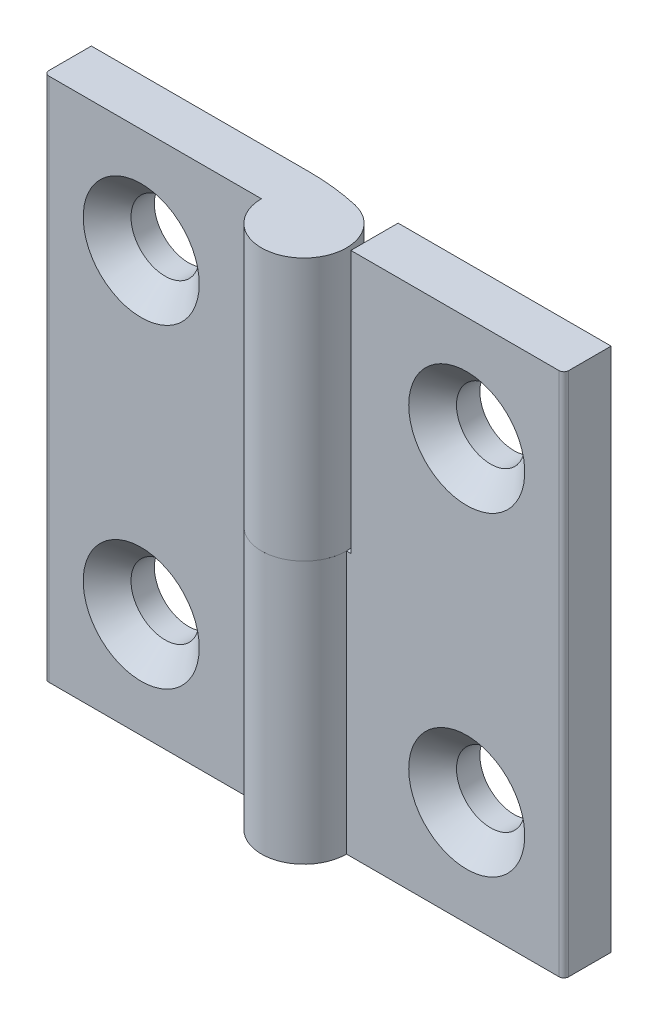
ISO-10303-21;
HEADER;
FILE_DESCRIPTION(('STEP AP214'),'2;1');
FILE_NAME('part.step','',(''),(''),'','','');
FILE_SCHEMA(('AUTOMOTIVE_DESIGN { 1 0 10303 214 1 1 1 1 }'));
ENDSEC;
DATA;
#1=APPLICATION_CONTEXT('core data for automotive mechanical design processes');
#2=APPLICATION_PROTOCOL_DEFINITION('international standard','automotive_design',2000,#1);
#3=PRODUCT_CONTEXT('',#1,'mechanical');
#4=PRODUCT('Part','Part','',(#3));
#5=PRODUCT_RELATED_PRODUCT_CATEGORY('part','',(#4));
#6=PRODUCT_DEFINITION_FORMATION('','',#4);
#7=PRODUCT_DEFINITION_CONTEXT('part definition',#1,'design');
#8=PRODUCT_DEFINITION('design','',#6,#7);
#9=PRODUCT_DEFINITION_SHAPE('','',#8);
#10=(LENGTH_UNIT() NAMED_UNIT(*) SI_UNIT(.MILLI.,.METRE.));
#11=(NAMED_UNIT(*) PLANE_ANGLE_UNIT() SI_UNIT($,.RADIAN.));
#12=(NAMED_UNIT(*) SI_UNIT($,.STERADIAN.) SOLID_ANGLE_UNIT());
#13=UNCERTAINTY_MEASURE_WITH_UNIT(LENGTH_MEASURE(1.E-05),#10,'distance_accuracy_value','');
#14=(GEOMETRIC_REPRESENTATION_CONTEXT(3) GLOBAL_UNCERTAINTY_ASSIGNED_CONTEXT((#13)) GLOBAL_UNIT_ASSIGNED_CONTEXT((#10,
#11,#12)) REPRESENTATION_CONTEXT('',''));
#15=CARTESIAN_POINT('',(0.,0.,0.));
#16=DIRECTION('',(0.,0.,1.));
#17=DIRECTION('',(1.,0.,0.));
#18=AXIS2_PLACEMENT_3D('',#15,#16,#17);
#19=CARTESIAN_POINT('',(-4.46399999999999,-25.,-5.87395000000017));
#20=DIRECTION('',(0.,0.,-1.));
#21=DIRECTION('',(-1.,0.,0.));
#22=AXIS2_PLACEMENT_3D('',#19,#20,#21);
#23=PLANE('',#22);
#24=DIRECTION('',(1.,0.,0.));
#25=VECTOR('',#24,1.);
#26=CARTESIAN_POINT('',(-4.46399999999999,25.,-5.87394999999983));
#27=LINE('',#26,#25);
#28=CARTESIAN_POINT('',(-24.3,25.,-5.87394999999982));
#29=VERTEX_POINT('',#28);
#30=CARTESIAN_POINT('',(-4.05,25.,-5.87394999999983));
#31=VERTEX_POINT('',#30);
#32=EDGE_CURVE('E198',#29,#31,#27,.T.);
#33=ORIENTED_EDGE('',*,*,#32,.F.);
#34=DIRECTION('',(0.,1.,0.));
#35=VECTOR('',#34,1.);
#36=CARTESIAN_POINT('',(-24.3,-25.,-5.87395000000017));
#37=LINE('',#36,#35);
#38=CARTESIAN_POINT('',(-24.3,-25.,-5.87395000000017));
#39=VERTEX_POINT('',#38);
#40=EDGE_CURVE('E55',#29,#39,#37,.F.);
#41=ORIENTED_EDGE('',*,*,#40,.T.);
#42=DIRECTION('',(-1.,0.,0.));
#43=VECTOR('',#42,1.);
#44=CARTESIAN_POINT('',(-4.46399999999999,-25.,-5.87395000000017));
#45=LINE('',#44,#43);
#46=CARTESIAN_POINT('',(-4.46399999999999,-25.,-5.87395000000017));
#47=VERTEX_POINT('',#46);
#48=EDGE_CURVE('E187',#47,#39,#45,.T.);
#49=ORIENTED_EDGE('',*,*,#48,.F.);
#50=DIRECTION('',(0.,-1.,0.));
#51=VECTOR('',#50,1.);
#52=CARTESIAN_POINT('',(-4.46399999999999,25.,-5.87394999999983));
#53=LINE('',#52,#51);
#54=CARTESIAN_POINT('',(-4.46399999999999,0.,-5.87395));
#55=VERTEX_POINT('',#54);
#56=EDGE_CURVE('E134',#55,#47,#53,.T.);
#57=ORIENTED_EDGE('',*,*,#56,.F.);
#58=DIRECTION('',(1.,0.,0.));
#59=VECTOR('',#58,1.);
#60=CARTESIAN_POINT('',(-4.46399999999999,0.,-5.87395));
#61=LINE('',#60,#59);
#62=CARTESIAN_POINT('',(-4.05,0.,-5.87395));
#63=VERTEX_POINT('',#62);
#64=EDGE_CURVE('E126',#55,#63,#61,.T.);
#65=ORIENTED_EDGE('',*,*,#64,.T.);
#66=DIRECTION('',(0.,1.,0.));
#67=VECTOR('',#66,1.);
#68=CARTESIAN_POINT('',(-4.05,0.,-5.87395));
#69=LINE('',#68,#67);
#70=EDGE_CURVE('E113',#63,#31,#69,.T.);
#71=ORIENTED_EDGE('',*,*,#70,.T.);
#72=EDGE_LOOP('',(#33,#41,#49,#57,#65,#71));
#73=FACE_BOUND('',#72,.T.);
#74=CARTESIAN_POINT('',(-15.5,15.,-5.87394999999989));
#75=DIRECTION('',(0.,0.,1.));
#76=DIRECTION('',(1.,0.,0.));
#77=AXIS2_PLACEMENT_3D('',#74,#75,#76);
#78=CIRCLE('',#77,5.525);
#79=CARTESIAN_POINT('',(-9.97499999999999,15.,-5.87394999999989));
#80=VERTEX_POINT('',#79);
#81=EDGE_CURVE('E154',#80,#80,#78,.T.);
#82=ORIENTED_EDGE('',*,*,#81,.F.);
#83=EDGE_LOOP('',(#82));
#84=FACE_BOUND('',#83,.T.);
#85=CARTESIAN_POINT('',(-15.5,-15.,-5.8739500000001));
#86=DIRECTION('',(0.,0.,-1.));
#87=DIRECTION('',(1.,0.,0.));
#88=AXIS2_PLACEMENT_3D('',#85,#86,#87);
#89=CIRCLE('',#88,5.525);
#90=CARTESIAN_POINT('',(-9.97499999999999,-15.,-5.8739500000001));
#91=VERTEX_POINT('',#90);
#92=EDGE_CURVE('E167',#91,#91,#89,.T.);
#93=ORIENTED_EDGE('',*,*,#92,.T.);
#94=EDGE_LOOP('',(#93));
#95=FACE_BOUND('',#94,.T.);
#96=ADVANCED_FACE('F46',(#73,#84,#95),#23,.F.);
#97=CARTESIAN_POINT('',(-15.5,-15.,-10.3740000000001));
#98=DIRECTION('',(0.,0.,1.));
#99=DIRECTION('',(1.,0.,0.));
#100=AXIS2_PLACEMENT_3D('',#97,#98,#99);
#101=CYLINDRICAL_SURFACE('',#100,3.25);
#102=CARTESIAN_POINT('',(-15.5,-15.,-10.3739500000001));
#103=DIRECTION('',(0.,0.,-1.));
#104=DIRECTION('',(-1.,0.,0.));
#105=AXIS2_PLACEMENT_3D('',#102,#103,#104);
#106=CIRCLE('',#105,3.25);
#107=CARTESIAN_POINT('',(-18.75,-15.,-10.3739500000001));
#108=VERTEX_POINT('',#107);
#109=EDGE_CURVE('E160',#108,#108,#106,.F.);
#110=ORIENTED_EDGE('',*,*,#109,.F.);
#111=EDGE_LOOP('',(#110));
#112=FACE_BOUND('',#111,.T.);
#113=CARTESIAN_POINT('',(-15.5,-15.,-8.1489500000001));
#114=DIRECTION('',(0.,0.,1.));
#115=DIRECTION('',(1.,0.,0.));
#116=AXIS2_PLACEMENT_3D('',#113,#114,#115);
#117=CIRCLE('',#116,3.25);
#118=CARTESIAN_POINT('',(-12.25,-15.,-8.1489500000001));
#119=VERTEX_POINT('',#118);
#120=EDGE_CURVE('E50',#119,#119,#117,.T.);
#121=ORIENTED_EDGE('',*,*,#120,.T.);
#122=EDGE_LOOP('',(#121));
#123=FACE_BOUND('',#122,.T.);
#124=ADVANCED_FACE('F235',(#112,#123),#101,.F.);
#125=CARTESIAN_POINT('',(-4.46399999999999,-25.,-10.3739500000002));
#126=DIRECTION('',(0.,0.,-1.));
#127=DIRECTION('',(-1.,0.,0.));
#128=AXIS2_PLACEMENT_3D('',#125,#126,#127);
#129=PLANE('',#128);
#130=DIRECTION('',(1.,0.,0.));
#131=VECTOR('',#130,1.);
#132=CARTESIAN_POINT('',(-4.46399999999999,25.,-10.3739499999998));
#133=LINE('',#132,#131);
#134=CARTESIAN_POINT('',(-24.75,25.,-10.3739499999998));
#135=VERTEX_POINT('',#134);
#136=CARTESIAN_POINT('',(-4.05,25.,-10.3739499999998));
#137=VERTEX_POINT('',#136);
#138=EDGE_CURVE('E190',#135,#137,#133,.T.);
#139=ORIENTED_EDGE('',*,*,#138,.T.);
#140=DIRECTION('',(0.,1.,0.));
#141=VECTOR('',#140,1.);
#142=CARTESIAN_POINT('',(-4.05,0.,-10.37395));
#143=LINE('',#142,#141);
#144=CARTESIAN_POINT('',(-4.05,0.,-10.37395));
#145=VERTEX_POINT('',#144);
#146=EDGE_CURVE('E180',#145,#137,#143,.T.);
#147=ORIENTED_EDGE('',*,*,#146,.F.);
#148=DIRECTION('',(-1.,0.,0.));
#149=VECTOR('',#148,1.);
#150=CARTESIAN_POINT('',(-4.05,0.,-10.37395));
#151=LINE('',#150,#149);
#152=CARTESIAN_POINT('',(-4.46399999999999,0.,-10.37395));
#153=VERTEX_POINT('',#152);
#154=EDGE_CURVE('E121',#145,#153,#151,.T.);
#155=ORIENTED_EDGE('',*,*,#154,.T.);
#156=DIRECTION('',(0.,-1.,0.));
#157=VECTOR('',#156,1.);
#158=CARTESIAN_POINT('',(-4.46399999999999,25.,-10.3739499999998));
#159=LINE('',#158,#157);
#160=CARTESIAN_POINT('',(-4.46399999999999,-25.,-10.3739500000002));
#161=VERTEX_POINT('',#160);
#162=EDGE_CURVE('E183',#153,#161,#159,.T.);
#163=ORIENTED_EDGE('',*,*,#162,.T.);
#164=DIRECTION('',(-1.,0.,0.));
#165=VECTOR('',#164,1.);
#166=CARTESIAN_POINT('',(-4.46399999999999,-25.,-10.3739500000002));
#167=LINE('',#166,#165);
#168=CARTESIAN_POINT('',(-24.75,-25.,-10.3739500000002));
#169=VERTEX_POINT('',#168);
#170=EDGE_CURVE('E193',#161,#169,#167,.T.);
#171=ORIENTED_EDGE('',*,*,#170,.T.);
#172=DIRECTION('',(0.,1.,0.));
#173=VECTOR('',#172,1.);
#174=CARTESIAN_POINT('',(-24.75,25.,-10.3739499999998));
#175=LINE('',#174,#173);
#176=EDGE_CURVE('E201',#169,#135,#175,.T.);
#177=ORIENTED_EDGE('',*,*,#176,.T.);
#178=EDGE_LOOP('',(#139,#147,#155,#163,#171,#177));
#179=FACE_BOUND('',#178,.T.);
#180=CARTESIAN_POINT('',(-15.5,15.,-10.3739499999999));
#181=DIRECTION('',(0.,0.,-1.));
#182=DIRECTION('',(-1.,0.,0.));
#183=AXIS2_PLACEMENT_3D('',#180,#181,#182);
#184=CIRCLE('',#183,3.25);
#185=CARTESIAN_POINT('',(-18.75,15.,-10.3739499999999));
#186=VERTEX_POINT('',#185);
#187=EDGE_CURVE('E148',#186,#186,#184,.T.);
#188=ORIENTED_EDGE('',*,*,#187,.F.);
#189=EDGE_LOOP('',(#188));
#190=FACE_BOUND('',#189,.T.);
#191=ORIENTED_EDGE('',*,*,#109,.T.);
#192=EDGE_LOOP('',(#191));
#193=FACE_BOUND('',#192,.T.);
#194=ADVANCED_FACE('F224',(#179,#190,#193),#129,.T.);
#195=CARTESIAN_POINT('',(-4.46399999999999,25.,-5.87394999999983));
#196=DIRECTION('',(1.,0.,0.));
#197=DIRECTION('',(0.,0.,-1.));
#198=AXIS2_PLACEMENT_3D('',#195,#196,#197);
#199=PLANE('',#198);
#200=ORIENTED_EDGE('',*,*,#162,.F.);
#201=DIRECTION('',(0.,0.,1.));
#202=VECTOR('',#201,1.);
#203=CARTESIAN_POINT('',(-4.46399999999999,0.,-10.37395));
#204=LINE('',#203,#202);
#205=EDGE_CURVE('E135',#153,#55,#204,.T.);
#206=ORIENTED_EDGE('',*,*,#205,.T.);
#207=ORIENTED_EDGE('',*,*,#56,.T.);
#208=DIRECTION('',(0.,0.,-1.));
#209=VECTOR('',#208,1.);
#210=CARTESIAN_POINT('',(-4.46399999999999,-25.,-5.87395000000017));
#211=LINE('',#210,#209);
#212=EDGE_CURVE('E194',#47,#161,#211,.T.);
#213=ORIENTED_EDGE('',*,*,#212,.T.);
#214=EDGE_LOOP('',(#200,#206,#207,#213));
#215=FACE_BOUND('',#214,.T.);
#216=ADVANCED_FACE('F228',(#215),#199,.T.);
#217=CARTESIAN_POINT('',(-4.46399999999999,25.,-5.87394999999983));
#218=DIRECTION('',(0.,1.,0.));
#219=DIRECTION('',(0.,0.,-1.));
#220=AXIS2_PLACEMENT_3D('',#217,#218,#219);
#221=PLANE('',#220);
#222=DIRECTION('',(0.,0.,-1.));
#223=VECTOR('',#222,1.);
#224=CARTESIAN_POINT('',(-24.75,25.,-5.87394999999982));
#225=LINE('',#224,#223);
#226=CARTESIAN_POINT('',(-24.75,25.,-6.32394999999982));
#227=VERTEX_POINT('',#226);
#228=EDGE_CURVE('E158',#227,#135,#225,.T.);
#229=ORIENTED_EDGE('',*,*,#228,.F.);
#230=CARTESIAN_POINT('',(-24.3,25.,-6.32394999999982));
#231=DIRECTION('',(0.,1.,0.));
#232=DIRECTION('',(0.,0.,-1.));
#233=AXIS2_PLACEMENT_3D('',#230,#231,#232);
#234=CIRCLE('',#233,0.45);
#235=EDGE_CURVE('E70',#227,#29,#234,.T.);
#236=ORIENTED_EDGE('',*,*,#235,.T.);
#237=ORIENTED_EDGE('',*,*,#32,.T.);
#238=CARTESIAN_POINT('',(0.,25.,-5.87394999999982));
#239=DIRECTION('',(0.,1.,0.));
#240=DIRECTION('',(0.,0.,-1.));
#241=AXIS2_PLACEMENT_3D('',#238,#239,#240);
#242=CIRCLE('',#241,4.05);
#243=CARTESIAN_POINT('',(0.889024390243916,25.,-9.82516951219495));
#244=VERTEX_POINT('',#243);
#245=EDGE_CURVE('E118',#31,#244,#242,.T.);
#246=ORIENTED_EDGE('',*,*,#245,.T.);
#247=CARTESIAN_POINT('',(-4.04999999999999,24.9999999999999,12.12605));
#248=DIRECTION('',(0.,1.,0.));
#249=DIRECTION('',(0.,0.,1.));
#250=AXIS2_PLACEMENT_3D('',#247,#248,#249);
#251=CIRCLE('',#250,22.4999999999999);
#252=EDGE_CURVE('E137',#244,#137,#251,.T.);
#253=ORIENTED_EDGE('',*,*,#252,.T.);
#254=ORIENTED_EDGE('',*,*,#138,.F.);
#255=EDGE_LOOP('',(#229,#236,#237,#246,#253,#254));
#256=FACE_BOUND('',#255,.T.);
#257=ADVANCED_FACE('F221',(#256),#221,.T.);
#258=CARTESIAN_POINT('',(-24.75,25.,-5.87394999999982));
#259=DIRECTION('',(-1.,0.,0.));
#260=DIRECTION('',(0.,0.,1.));
#261=AXIS2_PLACEMENT_3D('',#258,#259,#260);
#262=PLANE('',#261);
#263=DIRECTION('',(0.,0.,-1.));
#264=VECTOR('',#263,1.);
#265=CARTESIAN_POINT('',(-24.75,-25.,-5.87395000000017));
#266=LINE('',#265,#264);
#267=CARTESIAN_POINT('',(-24.75,-25.,-6.32395000000017));
#268=VERTEX_POINT('',#267);
#269=EDGE_CURVE('E205',#268,#169,#266,.T.);
#270=ORIENTED_EDGE('',*,*,#269,.F.);
#271=DIRECTION('',(0.,1.,0.));
#272=VECTOR('',#271,1.);
#273=CARTESIAN_POINT('',(-24.75,25.,-6.32394999999982));
#274=LINE('',#273,#272);
#275=EDGE_CURVE('E155',#268,#227,#274,.T.);
#276=ORIENTED_EDGE('',*,*,#275,.T.);
#277=ORIENTED_EDGE('',*,*,#228,.T.);
#278=ORIENTED_EDGE('',*,*,#176,.F.);
#279=EDGE_LOOP('',(#270,#276,#277,#278));
#280=FACE_BOUND('',#279,.T.);
#281=ADVANCED_FACE('F219',(#280),#262,.T.);
#282=CARTESIAN_POINT('',(-4.46399999999999,-25.,-5.87395000000017));
#283=DIRECTION('',(0.,-1.,0.));
#284=DIRECTION('',(0.,0.,1.));
#285=AXIS2_PLACEMENT_3D('',#282,#283,#284);
#286=PLANE('',#285);
#287=ORIENTED_EDGE('',*,*,#48,.T.);
#288=CARTESIAN_POINT('',(-24.3,-25.,-6.32395000000017));
#289=DIRECTION('',(0.,-1.,0.));
#290=DIRECTION('',(0.,0.,1.));
#291=AXIS2_PLACEMENT_3D('',#288,#289,#290);
#292=CIRCLE('',#291,0.45);
#293=EDGE_CURVE('E12',#39,#268,#292,.T.);
#294=ORIENTED_EDGE('',*,*,#293,.T.);
#295=ORIENTED_EDGE('',*,*,#269,.T.);
#296=ORIENTED_EDGE('',*,*,#170,.F.);
#297=ORIENTED_EDGE('',*,*,#212,.F.);
#298=EDGE_LOOP('',(#287,#294,#295,#296,#297));
#299=FACE_BOUND('',#298,.T.);
#300=ADVANCED_FACE('F215',(#299),#286,.T.);
#301=CARTESIAN_POINT('',(-4.04999999999999,-1.20896207412848E-13,12.1260499999999));
#302=DIRECTION('',(0.,1.,0.));
#303=DIRECTION('',(0.,0.,-1.));
#304=AXIS2_PLACEMENT_3D('',#301,#302,#303);
#305=CYLINDRICAL_SURFACE('',#304,22.4999999999999);
#306=ORIENTED_EDGE('',*,*,#252,.F.);
#307=DIRECTION('',(0.,1.,0.));
#308=VECTOR('',#307,1.);
#309=CARTESIAN_POINT('',(0.889024390243916,0.,-9.82516951219512));
#310=LINE('',#309,#308);
#311=CARTESIAN_POINT('',(0.889024390243916,0.,-9.82516951219512));
#312=VERTEX_POINT('',#311);
#313=EDGE_CURVE('E120',#312,#244,#310,.T.);
#314=ORIENTED_EDGE('',*,*,#313,.F.);
#315=CARTESIAN_POINT('',(-4.04999999999999,-1.20896207412848E-13,12.1260499999999));
#316=DIRECTION('',(0.,1.,0.));
#317=DIRECTION('',(0.,0.,1.));
#318=AXIS2_PLACEMENT_3D('',#315,#316,#317);
#319=CIRCLE('',#318,22.4999999999999);
#320=EDGE_CURVE('E130',#312,#145,#319,.T.);
#321=ORIENTED_EDGE('',*,*,#320,.T.);
#322=ORIENTED_EDGE('',*,*,#146,.T.);
#323=EDGE_LOOP('',(#306,#314,#321,#322));
#324=FACE_BOUND('',#323,.T.);
#325=ADVANCED_FACE('F227',(#324),#305,.T.);
#326=CARTESIAN_POINT('',(0.,0.,-5.87395));
#327=DIRECTION('',(0.,1.,0.));
#328=DIRECTION('',(0.,0.,-1.));
#329=AXIS2_PLACEMENT_3D('',#326,#327,#328);
#330=CYLINDRICAL_SURFACE('',#329,4.05);
#331=ORIENTED_EDGE('',*,*,#245,.F.);
#332=ORIENTED_EDGE('',*,*,#70,.F.);
#333=CARTESIAN_POINT('',(0.,0.,-5.87395));
#334=DIRECTION('',(0.,1.,0.));
#335=DIRECTION('',(0.,0.,-1.));
#336=AXIS2_PLACEMENT_3D('',#333,#334,#335);
#337=CIRCLE('',#336,4.05);
#338=EDGE_CURVE('E116',#63,#312,#337,.T.);
#339=ORIENTED_EDGE('',*,*,#338,.T.);
#340=ORIENTED_EDGE('',*,*,#313,.T.);
#341=EDGE_LOOP('',(#331,#332,#339,#340));
#342=FACE_BOUND('',#341,.T.);
#343=ADVANCED_FACE('F115',(#342),#330,.T.);
#344=CARTESIAN_POINT('',(0.,0.,-5.87395));
#345=DIRECTION('',(0.,1.,0.));
#346=DIRECTION('',(0.,0.,-1.));
#347=AXIS2_PLACEMENT_3D('',#344,#345,#346);
#348=PLANE('',#347);
#349=ORIENTED_EDGE('',*,*,#205,.F.);
#350=ORIENTED_EDGE('',*,*,#154,.F.);
#351=ORIENTED_EDGE('',*,*,#320,.F.);
#352=ORIENTED_EDGE('',*,*,#338,.F.);
#353=ORIENTED_EDGE('',*,*,#64,.F.);
#354=EDGE_LOOP('',(#349,#350,#351,#352,#353));
#355=FACE_BOUND('',#354,.T.);
#356=ADVANCED_FACE('F125',(#355),#348,.F.);
#357=CARTESIAN_POINT('',(-15.5,15.,-10.3739999999999));
#358=DIRECTION('',(0.,0.,1.));
#359=DIRECTION('',(1.,0.,0.));
#360=AXIS2_PLACEMENT_3D('',#357,#358,#359);
#361=CYLINDRICAL_SURFACE('',#360,3.25);
#362=CARTESIAN_POINT('',(-15.5,15.,-8.14894999999989));
#363=DIRECTION('',(0.,0.,1.));
#364=DIRECTION('',(1.,0.,0.));
#365=AXIS2_PLACEMENT_3D('',#362,#363,#364);
#366=CIRCLE('',#365,3.25);
#367=CARTESIAN_POINT('',(-12.25,15.,-8.14894999999989));
#368=VERTEX_POINT('',#367);
#369=EDGE_CURVE('E151',#368,#368,#366,.T.);
#370=ORIENTED_EDGE('',*,*,#369,.T.);
#371=EDGE_LOOP('',(#370));
#372=FACE_BOUND('',#371,.T.);
#373=ORIENTED_EDGE('',*,*,#187,.T.);
#374=EDGE_LOOP('',(#373));
#375=FACE_BOUND('',#374,.T.);
#376=ADVANCED_FACE('F259',(#372,#375),#361,.F.);
#377=CARTESIAN_POINT('',(-15.5,15.,-5.87394999999989));
#378=DIRECTION('',(0.,0.,1.));
#379=DIRECTION('',(1.,0.,0.));
#380=AXIS2_PLACEMENT_3D('',#377,#378,#379);
#381=CONICAL_SURFACE('',#380,5.525,0.78539816339745);
#382=ORIENTED_EDGE('',*,*,#81,.T.);
#383=EDGE_LOOP('',(#382));
#384=FACE_BOUND('',#383,.T.);
#385=ORIENTED_EDGE('',*,*,#369,.F.);
#386=EDGE_LOOP('',(#385));
#387=FACE_BOUND('',#386,.T.);
#388=ADVANCED_FACE('F262',(#384,#387),#381,.F.);
#389=CARTESIAN_POINT('',(-24.3,25.,-6.32394999999982));
#390=DIRECTION('',(0.,-1.,0.));
#391=DIRECTION('',(0.,0.,1.));
#392=AXIS2_PLACEMENT_3D('',#389,#390,#391);
#393=CYLINDRICAL_SURFACE('',#392,0.45);
#394=ORIENTED_EDGE('',*,*,#293,.F.);
#395=ORIENTED_EDGE('',*,*,#40,.F.);
#396=ORIENTED_EDGE('',*,*,#235,.F.);
#397=ORIENTED_EDGE('',*,*,#275,.F.);
#398=EDGE_LOOP('',(#394,#395,#396,#397));
#399=FACE_BOUND('',#398,.T.);
#400=ADVANCED_FACE('F48',(#399),#393,.T.);
#401=CARTESIAN_POINT('',(-15.5,-15.,-5.8739500000001));
#402=DIRECTION('',(0.,0.,1.));
#403=DIRECTION('',(1.,0.,0.));
#404=AXIS2_PLACEMENT_3D('',#401,#402,#403);
#405=CONICAL_SURFACE('',#404,5.525,0.78539816339745);
#406=ORIENTED_EDGE('',*,*,#120,.F.);
#407=EDGE_LOOP('',(#406));
#408=FACE_BOUND('',#407,.T.);
#409=ORIENTED_EDGE('',*,*,#92,.F.);
#410=EDGE_LOOP('',(#409));
#411=FACE_BOUND('',#410,.T.);
#412=ADVANCED_FACE('F267',(#408,#411),#405,.F.);
#413=CLOSED_SHELL('',(#96,#124,#194,#216,#257,#281,#300,#325,#343,#356,#376,#388,#400,#412));
#414=MANIFOLD_SOLID_BREP('B2',#413);
#415=CARTESIAN_POINT('',(4.464,25.,-5.87394999999982));
#416=DIRECTION('',(0.,0.,-1.));
#417=DIRECTION('',(1.,0.,0.));
#418=AXIS2_PLACEMENT_3D('',#415,#416,#417);
#419=PLANE('',#418);
#420=DIRECTION('',(-1.,0.,0.));
#421=VECTOR('',#420,1.);
#422=CARTESIAN_POINT('',(4.464,-25.,-5.87395000000017));
#423=LINE('',#422,#421);
#424=CARTESIAN_POINT('',(24.3,-25.,-5.87395000000017));
#425=VERTEX_POINT('',#424);
#426=CARTESIAN_POINT('',(4.05,-25.,-5.87395000000017));
#427=VERTEX_POINT('',#426);
#428=EDGE_CURVE('E516',#425,#427,#423,.T.);
#429=ORIENTED_EDGE('',*,*,#428,.F.);
#430=DIRECTION('',(0.,-1.,0.));
#431=VECTOR('',#430,1.);
#432=CARTESIAN_POINT('',(24.3,25.,-5.87394999999982));
#433=LINE('',#432,#431);
#434=CARTESIAN_POINT('',(24.3,25.,-5.87394999999982));
#435=VERTEX_POINT('',#434);
#436=EDGE_CURVE('E373',#425,#435,#433,.F.);
#437=ORIENTED_EDGE('',*,*,#436,.T.);
#438=DIRECTION('',(1.,0.,0.));
#439=VECTOR('',#438,1.);
#440=CARTESIAN_POINT('',(4.464,25.,-5.87394999999982));
#441=LINE('',#440,#439);
#442=CARTESIAN_POINT('',(4.464,25.,-5.87394999999982));
#443=VERTEX_POINT('',#442);
#444=EDGE_CURVE('E505',#443,#435,#441,.T.);
#445=ORIENTED_EDGE('',*,*,#444,.F.);
#446=DIRECTION('',(0.,1.,0.));
#447=VECTOR('',#446,1.);
#448=CARTESIAN_POINT('',(4.464,-25.,-5.87395000000017));
#449=LINE('',#448,#447);
#450=CARTESIAN_POINT('',(4.464,0.,-5.87395));
#451=VERTEX_POINT('',#450);
#452=EDGE_CURVE('E452',#451,#443,#449,.T.);
#453=ORIENTED_EDGE('',*,*,#452,.F.);
#454=DIRECTION('',(-1.,0.,0.));
#455=VECTOR('',#454,1.);
#456=CARTESIAN_POINT('',(4.464,0.,-5.87395));
#457=LINE('',#456,#455);
#458=CARTESIAN_POINT('',(4.05,0.,-5.87395));
#459=VERTEX_POINT('',#458);
#460=EDGE_CURVE('E444',#451,#459,#457,.T.);
#461=ORIENTED_EDGE('',*,*,#460,.T.);
#462=DIRECTION('',(0.,-1.,0.));
#463=VECTOR('',#462,1.);
#464=CARTESIAN_POINT('',(4.05,0.,-5.87395));
#465=LINE('',#464,#463);
#466=EDGE_CURVE('E431',#459,#427,#465,.T.);
#467=ORIENTED_EDGE('',*,*,#466,.T.);
#468=EDGE_LOOP('',(#429,#437,#445,#453,#461,#467));
#469=FACE_BOUND('',#468,.T.);
#470=CARTESIAN_POINT('',(15.5,-15.,-5.8739500000001));
#471=DIRECTION('',(0.,0.,1.));
#472=DIRECTION('',(-1.,0.,0.));
#473=AXIS2_PLACEMENT_3D('',#470,#471,#472);
#474=CIRCLE('',#473,5.525);
#475=CARTESIAN_POINT('',(9.975,-15.,-5.8739500000001));
#476=VERTEX_POINT('',#475);
#477=EDGE_CURVE('E472',#476,#476,#474,.T.);
#478=ORIENTED_EDGE('',*,*,#477,.F.);
#479=EDGE_LOOP('',(#478));
#480=FACE_BOUND('',#479,.T.);
#481=CARTESIAN_POINT('',(15.5,15.,-5.87394999999989));
#482=DIRECTION('',(0.,0.,-1.));
#483=DIRECTION('',(-1.,0.,0.));
#484=AXIS2_PLACEMENT_3D('',#481,#482,#483);
#485=CIRCLE('',#484,5.525);
#486=CARTESIAN_POINT('',(9.975,15.,-5.87394999999989));
#487=VERTEX_POINT('',#486);
#488=EDGE_CURVE('E485',#487,#487,#485,.T.);
#489=ORIENTED_EDGE('',*,*,#488,.T.);
#490=EDGE_LOOP('',(#489));
#491=FACE_BOUND('',#490,.T.);
#492=ADVANCED_FACE('F364',(#469,#480,#491),#419,.F.);
#493=CARTESIAN_POINT('',(15.5,15.,-10.3739999999999));
#494=DIRECTION('',(0.,0.,1.));
#495=DIRECTION('',(-1.,0.,0.));
#496=AXIS2_PLACEMENT_3D('',#493,#494,#495);
#497=CYLINDRICAL_SURFACE('',#496,3.25);
#498=CARTESIAN_POINT('',(15.5,15.,-10.3739499999999));
#499=DIRECTION('',(0.,0.,-1.));
#500=DIRECTION('',(1.,0.,0.));
#501=AXIS2_PLACEMENT_3D('',#498,#499,#500);
#502=CIRCLE('',#501,3.25);
#503=CARTESIAN_POINT('',(18.75,15.,-10.3739499999999));
#504=VERTEX_POINT('',#503);
#505=EDGE_CURVE('E478',#504,#504,#502,.F.);
#506=ORIENTED_EDGE('',*,*,#505,.F.);
#507=EDGE_LOOP('',(#506));
#508=FACE_BOUND('',#507,.T.);
#509=CARTESIAN_POINT('',(15.5,15.,-8.14894999999988));
#510=DIRECTION('',(0.,0.,1.));
#511=DIRECTION('',(-1.,0.,0.));
#512=AXIS2_PLACEMENT_3D('',#509,#510,#511);
#513=CIRCLE('',#512,3.25);
#514=CARTESIAN_POINT('',(12.25,15.,-8.14894999999988));
#515=VERTEX_POINT('',#514);
#516=EDGE_CURVE('E368',#515,#515,#513,.T.);
#517=ORIENTED_EDGE('',*,*,#516,.T.);
#518=EDGE_LOOP('',(#517));
#519=FACE_BOUND('',#518,.T.);
#520=ADVANCED_FACE('F553',(#508,#519),#497,.F.);
#521=CARTESIAN_POINT('',(4.464,25.,-10.3739499999998));
#522=DIRECTION('',(0.,0.,-1.));
#523=DIRECTION('',(1.,0.,0.));
#524=AXIS2_PLACEMENT_3D('',#521,#522,#523);
#525=PLANE('',#524);
#526=DIRECTION('',(-1.,0.,0.));
#527=VECTOR('',#526,1.);
#528=CARTESIAN_POINT('',(4.464,-25.,-10.3739500000002));
#529=LINE('',#528,#527);
#530=CARTESIAN_POINT('',(24.75,-25.,-10.3739500000002));
#531=VERTEX_POINT('',#530);
#532=CARTESIAN_POINT('',(4.05,-25.,-10.3739500000002));
#533=VERTEX_POINT('',#532);
#534=EDGE_CURVE('E508',#531,#533,#529,.T.);
#535=ORIENTED_EDGE('',*,*,#534,.T.);
#536=DIRECTION('',(0.,-1.,0.));
#537=VECTOR('',#536,1.);
#538=CARTESIAN_POINT('',(4.05,0.,-10.37395));
#539=LINE('',#538,#537);
#540=CARTESIAN_POINT('',(4.05,0.,-10.37395));
#541=VERTEX_POINT('',#540);
#542=EDGE_CURVE('E498',#541,#533,#539,.T.);
#543=ORIENTED_EDGE('',*,*,#542,.F.);
#544=DIRECTION('',(1.,0.,0.));
#545=VECTOR('',#544,1.);
#546=CARTESIAN_POINT('',(4.05,0.,-10.37395));
#547=LINE('',#546,#545);
#548=CARTESIAN_POINT('',(4.464,0.,-10.37395));
#549=VERTEX_POINT('',#548);
#550=EDGE_CURVE('E439',#541,#549,#547,.T.);
#551=ORIENTED_EDGE('',*,*,#550,.T.);
#552=DIRECTION('',(0.,1.,0.));
#553=VECTOR('',#552,1.);
#554=CARTESIAN_POINT('',(4.464,-25.,-10.3739500000002));
#555=LINE('',#554,#553);
#556=CARTESIAN_POINT('',(4.464,25.,-10.3739499999998));
#557=VERTEX_POINT('',#556);
#558=EDGE_CURVE('E501',#549,#557,#555,.T.);
#559=ORIENTED_EDGE('',*,*,#558,.T.);
#560=DIRECTION('',(1.,0.,0.));
#561=VECTOR('',#560,1.);
#562=CARTESIAN_POINT('',(4.464,25.,-10.3739499999998));
#563=LINE('',#562,#561);
#564=CARTESIAN_POINT('',(24.75,25.,-10.3739499999998));
#565=VERTEX_POINT('',#564);
#566=EDGE_CURVE('E511',#557,#565,#563,.T.);
#567=ORIENTED_EDGE('',*,*,#566,.T.);
#568=DIRECTION('',(0.,-1.,0.));
#569=VECTOR('',#568,1.);
#570=CARTESIAN_POINT('',(24.75,-25.,-10.3739500000002));
#571=LINE('',#570,#569);
#572=EDGE_CURVE('E519',#565,#531,#571,.T.);
#573=ORIENTED_EDGE('',*,*,#572,.T.);
#574=EDGE_LOOP('',(#535,#543,#551,#559,#567,#573));
#575=FACE_BOUND('',#574,.T.);
#576=CARTESIAN_POINT('',(15.5,-15.,-10.3739500000001));
#577=DIRECTION('',(0.,0.,-1.));
#578=DIRECTION('',(1.,0.,0.));
#579=AXIS2_PLACEMENT_3D('',#576,#577,#578);
#580=CIRCLE('',#579,3.25);
#581=CARTESIAN_POINT('',(18.75,-15.,-10.3739500000001));
#582=VERTEX_POINT('',#581);
#583=EDGE_CURVE('E466',#582,#582,#580,.T.);
#584=ORIENTED_EDGE('',*,*,#583,.F.);
#585=EDGE_LOOP('',(#584));
#586=FACE_BOUND('',#585,.T.);
#587=ORIENTED_EDGE('',*,*,#505,.T.);
#588=EDGE_LOOP('',(#587));
#589=FACE_BOUND('',#588,.T.);
#590=ADVANCED_FACE('F542',(#575,#586,#589),#525,.T.);
#591=CARTESIAN_POINT('',(4.464,-25.,-5.87395000000017));
#592=DIRECTION('',(-1.,0.,0.));
#593=DIRECTION('',(0.,0.,-1.));
#594=AXIS2_PLACEMENT_3D('',#591,#592,#593);
#595=PLANE('',#594);
#596=ORIENTED_EDGE('',*,*,#558,.F.);
#597=DIRECTION('',(0.,0.,1.));
#598=VECTOR('',#597,1.);
#599=CARTESIAN_POINT('',(4.464,0.,-10.37395));
#600=LINE('',#599,#598);
#601=EDGE_CURVE('E453',#549,#451,#600,.T.);
#602=ORIENTED_EDGE('',*,*,#601,.T.);
#603=ORIENTED_EDGE('',*,*,#452,.T.);
#604=DIRECTION('',(0.,0.,-1.));
#605=VECTOR('',#604,1.);
#606=CARTESIAN_POINT('',(4.464,25.,-5.87394999999982));
#607=LINE('',#606,#605);
#608=EDGE_CURVE('E512',#443,#557,#607,.T.);
#609=ORIENTED_EDGE('',*,*,#608,.T.);
#610=EDGE_LOOP('',(#596,#602,#603,#609));
#611=FACE_BOUND('',#610,.T.);
#612=ADVANCED_FACE('F546',(#611),#595,.T.);
#613=CARTESIAN_POINT('',(4.464,-25.,-5.87395000000017));
#614=DIRECTION('',(0.,-1.,0.));
#615=DIRECTION('',(0.,0.,-1.));
#616=AXIS2_PLACEMENT_3D('',#613,#614,#615);
#617=PLANE('',#616);
#618=DIRECTION('',(0.,0.,-1.));
#619=VECTOR('',#618,1.);
#620=CARTESIAN_POINT('',(24.75,-25.,-5.87395000000017));
#621=LINE('',#620,#619);
#622=CARTESIAN_POINT('',(24.75,-25.,-6.32395000000017));
#623=VERTEX_POINT('',#622);
#624=EDGE_CURVE('E476',#623,#531,#621,.T.);
#625=ORIENTED_EDGE('',*,*,#624,.F.);
#626=CARTESIAN_POINT('',(24.3,-25.,-6.32395000000017));
#627=DIRECTION('',(0.,-1.,0.));
#628=DIRECTION('',(0.,0.,-1.));
#629=AXIS2_PLACEMENT_3D('',#626,#627,#628);
#630=CIRCLE('',#629,0.45);
#631=EDGE_CURVE('E388',#623,#425,#630,.T.);
#632=ORIENTED_EDGE('',*,*,#631,.T.);
#633=ORIENTED_EDGE('',*,*,#428,.T.);
#634=CARTESIAN_POINT('',(0.,-25.,-5.87395000000017));
#635=DIRECTION('',(0.,-1.,0.));
#636=DIRECTION('',(0.,0.,-1.));
#637=AXIS2_PLACEMENT_3D('',#634,#635,#636);
#638=CIRCLE('',#637,4.05);
#639=CARTESIAN_POINT('',(-0.889024390243908,-25.,-9.82516951219529));
#640=VERTEX_POINT('',#639);
#641=EDGE_CURVE('E436',#427,#640,#638,.T.);
#642=ORIENTED_EDGE('',*,*,#641,.T.);
#643=CARTESIAN_POINT('',(4.05,-25.0000000000001,12.1260499999997));
#644=DIRECTION('',(0.,-1.,0.));
#645=DIRECTION('',(0.,0.,1.));
#646=AXIS2_PLACEMENT_3D('',#643,#644,#645);
#647=CIRCLE('',#646,22.4999999999999);
#648=EDGE_CURVE('E455',#640,#533,#647,.T.);
#649=ORIENTED_EDGE('',*,*,#648,.T.);
#650=ORIENTED_EDGE('',*,*,#534,.F.);
#651=EDGE_LOOP('',(#625,#632,#633,#642,#649,#650));
#652=FACE_BOUND('',#651,.T.);
#653=ADVANCED_FACE('F539',(#652),#617,.T.);
#654=CARTESIAN_POINT('',(24.75,-25.,-5.87395000000017));
#655=DIRECTION('',(1.,0.,0.));
#656=DIRECTION('',(0.,0.,1.));
#657=AXIS2_PLACEMENT_3D('',#654,#655,#656);
#658=PLANE('',#657);
#659=DIRECTION('',(0.,0.,-1.));
#660=VECTOR('',#659,1.);
#661=CARTESIAN_POINT('',(24.75,25.,-5.87394999999982));
#662=LINE('',#661,#660);
#663=CARTESIAN_POINT('',(24.75,25.,-6.32394999999982));
#664=VERTEX_POINT('',#663);
#665=EDGE_CURVE('E523',#664,#565,#662,.T.);
#666=ORIENTED_EDGE('',*,*,#665,.F.);
#667=DIRECTION('',(0.,-1.,0.));
#668=VECTOR('',#667,1.);
#669=CARTESIAN_POINT('',(24.75,-25.,-6.32395000000017));
#670=LINE('',#669,#668);
#671=EDGE_CURVE('E473',#664,#623,#670,.T.);
#672=ORIENTED_EDGE('',*,*,#671,.T.);
#673=ORIENTED_EDGE('',*,*,#624,.T.);
#674=ORIENTED_EDGE('',*,*,#572,.F.);
#675=EDGE_LOOP('',(#666,#672,#673,#674));
#676=FACE_BOUND('',#675,.T.);
#677=ADVANCED_FACE('F537',(#676),#658,.T.);
#678=CARTESIAN_POINT('',(4.464,25.,-5.87394999999982));
#679=DIRECTION('',(0.,1.,0.));
#680=DIRECTION('',(0.,0.,1.));
#681=AXIS2_PLACEMENT_3D('',#678,#679,#680);
#682=PLANE('',#681);
#683=ORIENTED_EDGE('',*,*,#444,.T.);
#684=CARTESIAN_POINT('',(24.3,25.,-6.32394999999982));
#685=DIRECTION('',(0.,1.,0.));
#686=DIRECTION('',(0.,0.,1.));
#687=AXIS2_PLACEMENT_3D('',#684,#685,#686);
#688=CIRCLE('',#687,0.45);
#689=EDGE_CURVE('E44',#435,#664,#688,.T.);
#690=ORIENTED_EDGE('',*,*,#689,.T.);
#691=ORIENTED_EDGE('',*,*,#665,.T.);
#692=ORIENTED_EDGE('',*,*,#566,.F.);
#693=ORIENTED_EDGE('',*,*,#608,.F.);
#694=EDGE_LOOP('',(#683,#690,#691,#692,#693));
#695=FACE_BOUND('',#694,.T.);
#696=ADVANCED_FACE('F533',(#695),#682,.T.);
#697=CARTESIAN_POINT('',(4.05,-1.20896207412848E-13,12.1260499999999));
#698=DIRECTION('',(0.,-1.,0.));
#699=DIRECTION('',(0.,0.,-1.));
#700=AXIS2_PLACEMENT_3D('',#697,#698,#699);
#701=CYLINDRICAL_SURFACE('',#700,22.4999999999999);
#702=ORIENTED_EDGE('',*,*,#648,.F.);
#703=DIRECTION('',(0.,-1.,0.));
#704=VECTOR('',#703,1.);
#705=CARTESIAN_POINT('',(-0.889024390243908,0.,-9.82516951219512));
#706=LINE('',#705,#704);
#707=CARTESIAN_POINT('',(-0.889024390243908,0.,-9.82516951219512));
#708=VERTEX_POINT('',#707);
#709=EDGE_CURVE('E438',#708,#640,#706,.T.);
#710=ORIENTED_EDGE('',*,*,#709,.F.);
#711=CARTESIAN_POINT('',(4.05,-1.20896207412848E-13,12.1260499999999));
#712=DIRECTION('',(0.,-1.,0.));
#713=DIRECTION('',(0.,0.,1.));
#714=AXIS2_PLACEMENT_3D('',#711,#712,#713);
#715=CIRCLE('',#714,22.4999999999999);
#716=EDGE_CURVE('E448',#708,#541,#715,.T.);
#717=ORIENTED_EDGE('',*,*,#716,.T.);
#718=ORIENTED_EDGE('',*,*,#542,.T.);
#719=EDGE_LOOP('',(#702,#710,#717,#718));
#720=FACE_BOUND('',#719,.T.);
#721=ADVANCED_FACE('F545',(#720),#701,.T.);
#722=CARTESIAN_POINT('',(0.,0.,-5.87395));
#723=DIRECTION('',(0.,-1.,0.));
#724=DIRECTION('',(0.,0.,-1.));
#725=AXIS2_PLACEMENT_3D('',#722,#723,#724);
#726=CYLINDRICAL_SURFACE('',#725,4.05);
#727=ORIENTED_EDGE('',*,*,#641,.F.);
#728=ORIENTED_EDGE('',*,*,#466,.F.);
#729=CARTESIAN_POINT('',(0.,0.,-5.87395));
#730=DIRECTION('',(0.,-1.,0.));
#731=DIRECTION('',(0.,0.,-1.));
#732=AXIS2_PLACEMENT_3D('',#729,#730,#731);
#733=CIRCLE('',#732,4.05);
#734=EDGE_CURVE('E434',#459,#708,#733,.T.);
#735=ORIENTED_EDGE('',*,*,#734,.T.);
#736=ORIENTED_EDGE('',*,*,#709,.T.);
#737=EDGE_LOOP('',(#727,#728,#735,#736));
#738=FACE_BOUND('',#737,.T.);
#739=ADVANCED_FACE('F433',(#738),#726,.T.);
#740=CARTESIAN_POINT('',(0.,0.,-5.87395));
#741=DIRECTION('',(0.,-1.,0.));
#742=DIRECTION('',(0.,0.,-1.));
#743=AXIS2_PLACEMENT_3D('',#740,#741,#742);
#744=PLANE('',#743);
#745=ORIENTED_EDGE('',*,*,#601,.F.);
#746=ORIENTED_EDGE('',*,*,#550,.F.);
#747=ORIENTED_EDGE('',*,*,#716,.F.);
#748=ORIENTED_EDGE('',*,*,#734,.F.);
#749=ORIENTED_EDGE('',*,*,#460,.F.);
#750=EDGE_LOOP('',(#745,#746,#747,#748,#749));
#751=FACE_BOUND('',#750,.T.);
#752=ADVANCED_FACE('F443',(#751),#744,.F.);
#753=CARTESIAN_POINT('',(15.5,-15.,-10.3740000000001));
#754=DIRECTION('',(0.,0.,1.));
#755=DIRECTION('',(-1.,0.,0.));
#756=AXIS2_PLACEMENT_3D('',#753,#754,#755);
#757=CYLINDRICAL_SURFACE('',#756,3.25);
#758=CARTESIAN_POINT('',(15.5,-15.,-8.14895000000009));
#759=DIRECTION('',(0.,0.,1.));
#760=DIRECTION('',(-1.,0.,0.));
#761=AXIS2_PLACEMENT_3D('',#758,#759,#760);
#762=CIRCLE('',#761,3.25);
#763=CARTESIAN_POINT('',(12.25,-15.,-8.14895000000009));
#764=VERTEX_POINT('',#763);
#765=EDGE_CURVE('E469',#764,#764,#762,.T.);
#766=ORIENTED_EDGE('',*,*,#765,.T.);
#767=EDGE_LOOP('',(#766));
#768=FACE_BOUND('',#767,.T.);
#769=ORIENTED_EDGE('',*,*,#583,.T.);
#770=EDGE_LOOP('',(#769));
#771=FACE_BOUND('',#770,.T.);
#772=ADVANCED_FACE('F577',(#768,#771),#757,.F.);
#773=CARTESIAN_POINT('',(15.5,-15.,-5.8739500000001));
#774=DIRECTION('',(0.,0.,1.));
#775=DIRECTION('',(-1.,0.,0.));
#776=AXIS2_PLACEMENT_3D('',#773,#774,#775);
#777=CONICAL_SURFACE('',#776,5.525,0.78539816339745);
#778=ORIENTED_EDGE('',*,*,#477,.T.);
#779=EDGE_LOOP('',(#778));
#780=FACE_BOUND('',#779,.T.);
#781=ORIENTED_EDGE('',*,*,#765,.F.);
#782=EDGE_LOOP('',(#781));
#783=FACE_BOUND('',#782,.T.);
#784=ADVANCED_FACE('F580',(#780,#783),#777,.F.);
#785=CARTESIAN_POINT('',(24.3,-25.,-6.32395000000017));
#786=DIRECTION('',(0.,1.,0.));
#787=DIRECTION('',(0.,0.,1.));
#788=AXIS2_PLACEMENT_3D('',#785,#786,#787);
#789=CYLINDRICAL_SURFACE('',#788,0.45);
#790=ORIENTED_EDGE('',*,*,#689,.F.);
#791=ORIENTED_EDGE('',*,*,#436,.F.);
#792=ORIENTED_EDGE('',*,*,#631,.F.);
#793=ORIENTED_EDGE('',*,*,#671,.F.);
#794=EDGE_LOOP('',(#790,#791,#792,#793));
#795=FACE_BOUND('',#794,.T.);
#796=ADVANCED_FACE('F366',(#795),#789,.T.);
#797=CARTESIAN_POINT('',(15.5,15.,-5.87394999999989));
#798=DIRECTION('',(0.,0.,1.));
#799=DIRECTION('',(-1.,0.,0.));
#800=AXIS2_PLACEMENT_3D('',#797,#798,#799);
#801=CONICAL_SURFACE('',#800,5.525,0.78539816339745);
#802=ORIENTED_EDGE('',*,*,#516,.F.);
#803=EDGE_LOOP('',(#802));
#804=FACE_BOUND('',#803,.T.);
#805=ORIENTED_EDGE('',*,*,#488,.F.);
#806=EDGE_LOOP('',(#805));
#807=FACE_BOUND('',#806,.T.);
#808=ADVANCED_FACE('F585',(#804,#807),#801,.F.);
#809=CLOSED_SHELL('',(#492,#520,#590,#612,#653,#677,#696,#721,#739,#752,#772,#784,#796,#808));
#810=MANIFOLD_SOLID_BREP('B6',#809);
#811=ADVANCED_BREP_SHAPE_REPRESENTATION('',(#18,#414,#810),#14);
#812=SHAPE_DEFINITION_REPRESENTATION(#9,#811);
ENDSEC;
END-ISO-10303-21;
